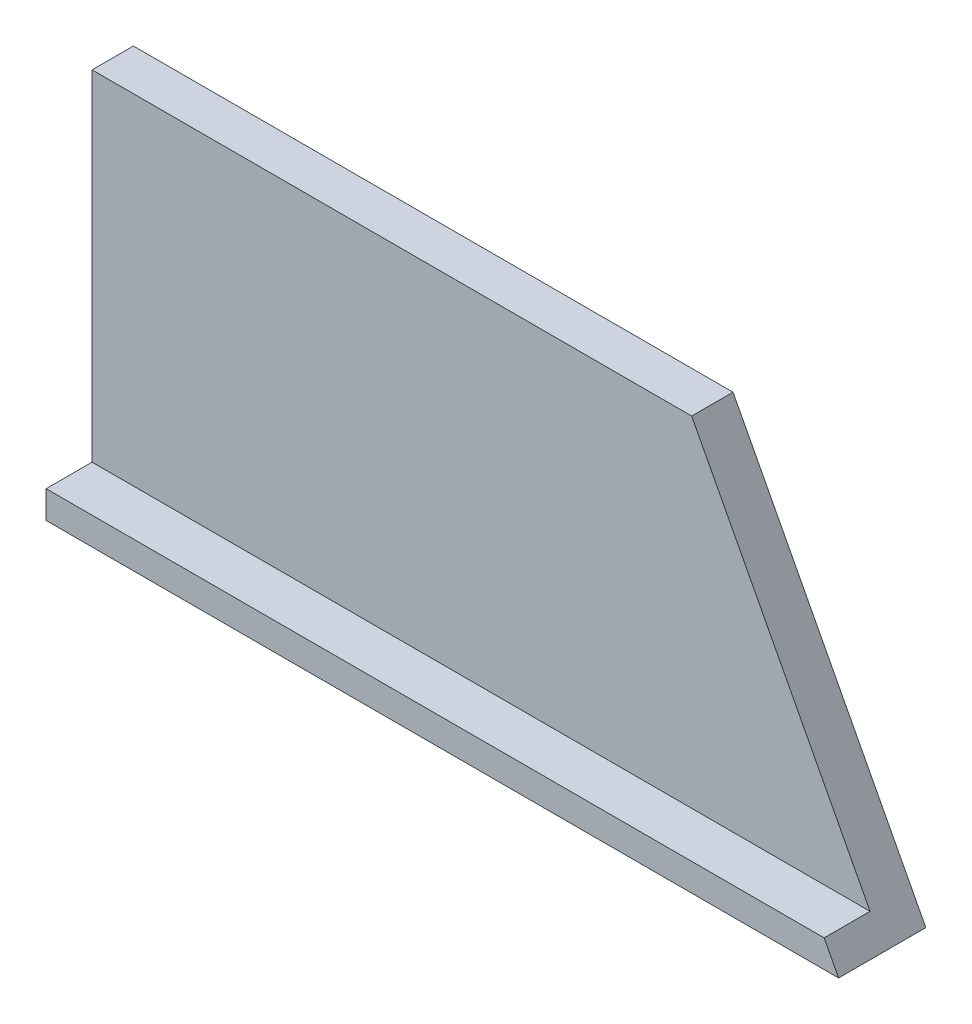
ISO-10303-21;
HEADER;
FILE_DESCRIPTION(('STEP AP214'),'2;1');
FILE_NAME('part.step','',(''),(''),'','','');
FILE_SCHEMA(('AUTOMOTIVE_DESIGN { 1 0 10303 214 1 1 1 1 }'));
ENDSEC;
DATA;
#1=APPLICATION_CONTEXT('core data for automotive mechanical design processes');
#2=APPLICATION_PROTOCOL_DEFINITION('international standard','automotive_design',2000,#1);
#3=PRODUCT_CONTEXT('',#1,'mechanical');
#4=PRODUCT('Part','Part','',(#3));
#5=PRODUCT_RELATED_PRODUCT_CATEGORY('part','',(#4));
#6=PRODUCT_DEFINITION_FORMATION('','',#4);
#7=PRODUCT_DEFINITION_CONTEXT('part definition',#1,'design');
#8=PRODUCT_DEFINITION('design','',#6,#7);
#9=PRODUCT_DEFINITION_SHAPE('','',#8);
#10=(LENGTH_UNIT() NAMED_UNIT(*) SI_UNIT(.MILLI.,.METRE.));
#11=(NAMED_UNIT(*) PLANE_ANGLE_UNIT() SI_UNIT($,.RADIAN.));
#12=(NAMED_UNIT(*) SI_UNIT($,.STERADIAN.) SOLID_ANGLE_UNIT());
#13=UNCERTAINTY_MEASURE_WITH_UNIT(LENGTH_MEASURE(1.E-05),#10,'distance_accuracy_value','');
#14=(GEOMETRIC_REPRESENTATION_CONTEXT(3) GLOBAL_UNCERTAINTY_ASSIGNED_CONTEXT((#13)) GLOBAL_UNIT_ASSIGNED_CONTEXT((#10,
#11,#12)) REPRESENTATION_CONTEXT('',''));
#15=CARTESIAN_POINT('',(0.,0.,0.));
#16=DIRECTION('',(0.,0.,1.));
#17=DIRECTION('',(1.,0.,0.));
#18=AXIS2_PLACEMENT_3D('',#15,#16,#17);
#19=CARTESIAN_POINT('',(156.4,4.5,9.5));
#20=DIRECTION('',(-0.885397902837944,-0.464833898989919,0.));
#21=DIRECTION('',(0.464833898989919,-0.885397902837944,0.));
#22=AXIS2_PLACEMENT_3D('',#19,#20,#21);
#23=PLANE('',#22);
#24=DIRECTION('',(0.,0.,-1.));
#25=VECTOR('',#24,1.);
#26=CARTESIAN_POINT('',(156.4,4.5,9.5));
#27=LINE('',#26,#25);
#28=CARTESIAN_POINT('',(156.4,4.5,9.5));
#29=VERTEX_POINT('',#28);
#30=CARTESIAN_POINT('',(156.4,4.5,0.));
#31=VERTEX_POINT('',#30);
#32=EDGE_CURVE('E11',#29,#31,#27,.T.);
#33=ORIENTED_EDGE('',*,*,#32,.T.);
#34=DIRECTION('',(0.46483389898992,-0.885397902837944,0.));
#35=VECTOR('',#34,1.);
#36=CARTESIAN_POINT('',(156.4,4.5,0.));
#37=LINE('',#36,#35);
#38=CARTESIAN_POINT('',(135.4,44.5,0.));
#39=VERTEX_POINT('',#38);
#40=EDGE_CURVE('E135',#39,#31,#37,.T.);
#41=ORIENTED_EDGE('',*,*,#40,.F.);
#42=DIRECTION('',(0.,0.,1.));
#43=VECTOR('',#42,1.);
#44=CARTESIAN_POINT('',(135.4,44.5,0.));
#45=LINE('',#44,#43);
#46=CARTESIAN_POINT('',(135.4,44.5,4.5));
#47=VERTEX_POINT('',#46);
#48=EDGE_CURVE('E132',#39,#47,#45,.T.);
#49=ORIENTED_EDGE('',*,*,#48,.T.);
#50=DIRECTION('',(-0.46483389898992,0.885397902837944,0.));
#51=VECTOR('',#50,1.);
#52=CARTESIAN_POINT('',(106.144047035767,100.225624693778,4.5));
#53=LINE('',#52,#51);
#54=CARTESIAN_POINT('',(154.825,7.49999999999999,4.5));
#55=VERTEX_POINT('',#54);
#56=EDGE_CURVE('E128',#55,#47,#53,.T.);
#57=ORIENTED_EDGE('',*,*,#56,.F.);
#58=DIRECTION('',(0.,0.,-1.));
#59=VECTOR('',#58,1.);
#60=CARTESIAN_POINT('',(154.825,7.5,9.5));
#61=LINE('',#60,#59);
#62=CARTESIAN_POINT('',(154.825,7.5,9.5));
#63=VERTEX_POINT('',#62);
#64=EDGE_CURVE('E46',#63,#55,#61,.T.);
#65=ORIENTED_EDGE('',*,*,#64,.F.);
#66=DIRECTION('',(-0.464833898989919,0.885397902837944,0.));
#67=VECTOR('',#66,1.);
#68=CARTESIAN_POINT('',(156.4,4.5,9.5));
#69=LINE('',#68,#67);
#70=EDGE_CURVE('E53',#29,#63,#69,.T.);
#71=ORIENTED_EDGE('',*,*,#70,.F.);
#72=EDGE_LOOP('',(#33,#41,#49,#57,#65,#71));
#73=FACE_BOUND('',#72,.T.);
#74=ADVANCED_FACE('F38',(#73),#23,.F.);
#75=CARTESIAN_POINT('',(0.,4.5,0.));
#76=DIRECTION('',(0.,0.,1.));
#77=DIRECTION('',(1.,0.,0.));
#78=AXIS2_PLACEMENT_3D('',#75,#76,#77);
#79=PLANE('',#78);
#80=ORIENTED_EDGE('',*,*,#40,.T.);
#81=DIRECTION('',(-1.,0.,0.));
#82=VECTOR('',#81,1.);
#83=CARTESIAN_POINT('',(0.,4.5,0.));
#84=LINE('',#83,#82);
#85=CARTESIAN_POINT('',(70.1,4.5,0.));
#86=VERTEX_POINT('',#85);
#87=EDGE_CURVE('E104',#31,#86,#84,.T.);
#88=ORIENTED_EDGE('',*,*,#87,.T.);
#89=DIRECTION('',(0.,1.,0.));
#90=VECTOR('',#89,1.);
#91=CARTESIAN_POINT('',(70.1,4.5,0.));
#92=LINE('',#91,#90);
#93=CARTESIAN_POINT('',(70.1,44.5,0.));
#94=VERTEX_POINT('',#93);
#95=EDGE_CURVE('E124',#86,#94,#92,.T.);
#96=ORIENTED_EDGE('',*,*,#95,.T.);
#97=DIRECTION('',(-1.,0.,0.));
#98=VECTOR('',#97,1.);
#99=CARTESIAN_POINT('',(0.,44.5,0.));
#100=LINE('',#99,#98);
#101=EDGE_CURVE('E111',#39,#94,#100,.T.);
#102=ORIENTED_EDGE('',*,*,#101,.F.);
#103=EDGE_LOOP('',(#80,#88,#96,#102));
#104=FACE_BOUND('',#103,.T.);
#105=ADVANCED_FACE('F141',(#104),#79,.F.);
#106=CARTESIAN_POINT('',(0.,44.5,0.));
#107=DIRECTION('',(0.,1.,0.));
#108=DIRECTION('',(0.,0.,1.));
#109=AXIS2_PLACEMENT_3D('',#106,#107,#108);
#110=PLANE('',#109);
#111=ORIENTED_EDGE('',*,*,#48,.F.);
#112=ORIENTED_EDGE('',*,*,#101,.T.);
#113=DIRECTION('',(0.,0.,1.));
#114=VECTOR('',#113,1.);
#115=CARTESIAN_POINT('',(70.1,44.5,0.));
#116=LINE('',#115,#114);
#117=CARTESIAN_POINT('',(70.1,44.5,4.5));
#118=VERTEX_POINT('',#117);
#119=EDGE_CURVE('E122',#94,#118,#116,.T.);
#120=ORIENTED_EDGE('',*,*,#119,.T.);
#121=DIRECTION('',(1.,0.,0.));
#122=VECTOR('',#121,1.);
#123=CARTESIAN_POINT('',(0.,44.5,4.5));
#124=LINE('',#123,#122);
#125=EDGE_CURVE('E112',#118,#47,#124,.T.);
#126=ORIENTED_EDGE('',*,*,#125,.T.);
#127=EDGE_LOOP('',(#111,#112,#120,#126));
#128=FACE_BOUND('',#127,.T.);
#129=ADVANCED_FACE('F144',(#128),#110,.T.);
#130=CARTESIAN_POINT('',(0.,44.5,4.5));
#131=DIRECTION('',(0.,0.,-1.));
#132=DIRECTION('',(-1.,0.,0.));
#133=AXIS2_PLACEMENT_3D('',#130,#131,#132);
#134=PLANE('',#133);
#135=DIRECTION('',(0.,1.,0.));
#136=VECTOR('',#135,1.);
#137=CARTESIAN_POINT('',(70.1,4.5,4.5));
#138=LINE('',#137,#136);
#139=CARTESIAN_POINT('',(70.1,7.49999999999999,4.5));
#140=VERTEX_POINT('',#139);
#141=EDGE_CURVE('E126',#140,#118,#138,.T.);
#142=ORIENTED_EDGE('',*,*,#141,.F.);
#143=DIRECTION('',(-1.,0.,0.));
#144=VECTOR('',#143,1.);
#145=CARTESIAN_POINT('',(154.825,7.5,4.5));
#146=LINE('',#145,#144);
#147=EDGE_CURVE('E103',#55,#140,#146,.T.);
#148=ORIENTED_EDGE('',*,*,#147,.F.);
#149=ORIENTED_EDGE('',*,*,#56,.T.);
#150=ORIENTED_EDGE('',*,*,#125,.F.);
#151=EDGE_LOOP('',(#142,#148,#149,#150));
#152=FACE_BOUND('',#151,.T.);
#153=ADVANCED_FACE('F146',(#152),#134,.F.);
#154=CARTESIAN_POINT('',(70.1,4.5,0.));
#155=DIRECTION('',(1.,0.,0.));
#156=DIRECTION('',(0.,0.,-1.));
#157=AXIS2_PLACEMENT_3D('',#154,#155,#156);
#158=PLANE('',#157);
#159=DIRECTION('',(0.,0.,1.));
#160=VECTOR('',#159,1.);
#161=CARTESIAN_POINT('',(70.1,4.5,0.));
#162=LINE('',#161,#160);
#163=CARTESIAN_POINT('',(70.1,4.5,9.5));
#164=VERTEX_POINT('',#163);
#165=EDGE_CURVE('E95',#86,#164,#162,.T.);
#166=ORIENTED_EDGE('',*,*,#165,.T.);
#167=DIRECTION('',(0.,-1.,0.));
#168=VECTOR('',#167,1.);
#169=CARTESIAN_POINT('',(70.1,7.49999999999999,9.5));
#170=LINE('',#169,#168);
#171=CARTESIAN_POINT('',(70.1,7.49999999999999,9.5));
#172=VERTEX_POINT('',#171);
#173=EDGE_CURVE('E89',#172,#164,#170,.T.);
#174=ORIENTED_EDGE('',*,*,#173,.F.);
#175=DIRECTION('',(0.,0.,-1.));
#176=VECTOR('',#175,1.);
#177=CARTESIAN_POINT('',(70.1,7.49999999999999,9.5));
#178=LINE('',#177,#176);
#179=EDGE_CURVE('E92',#172,#140,#178,.T.);
#180=ORIENTED_EDGE('',*,*,#179,.T.);
#181=ORIENTED_EDGE('',*,*,#141,.T.);
#182=ORIENTED_EDGE('',*,*,#119,.F.);
#183=ORIENTED_EDGE('',*,*,#95,.F.);
#184=EDGE_LOOP('',(#166,#174,#180,#181,#182,#183));
#185=FACE_BOUND('',#184,.T.);
#186=ADVANCED_FACE('F91',(#185),#158,.F.);
#187=CARTESIAN_POINT('',(0.,0.,9.5));
#188=DIRECTION('',(0.,0.,1.));
#189=DIRECTION('',(1.,0.,0.));
#190=AXIS2_PLACEMENT_3D('',#187,#188,#189);
#191=PLANE('',#190);
#192=ORIENTED_EDGE('',*,*,#173,.T.);
#193=DIRECTION('',(1.,0.,0.));
#194=VECTOR('',#193,1.);
#195=CARTESIAN_POINT('',(-21.,4.5,9.5));
#196=LINE('',#195,#194);
#197=EDGE_CURVE('E58',#164,#29,#196,.T.);
#198=ORIENTED_EDGE('',*,*,#197,.T.);
#199=ORIENTED_EDGE('',*,*,#70,.T.);
#200=DIRECTION('',(-1.,0.,0.));
#201=VECTOR('',#200,1.);
#202=CARTESIAN_POINT('',(154.825,7.5,9.5));
#203=LINE('',#202,#201);
#204=EDGE_CURVE('E102',#63,#172,#203,.T.);
#205=ORIENTED_EDGE('',*,*,#204,.T.);
#206=EDGE_LOOP('',(#192,#198,#199,#205));
#207=FACE_BOUND('',#206,.T.);
#208=ADVANCED_FACE('F106',(#207),#191,.T.);
#209=CARTESIAN_POINT('',(154.825,7.5,9.5));
#210=DIRECTION('',(0.,-1.,0.));
#211=DIRECTION('',(1.,0.,0.));
#212=AXIS2_PLACEMENT_3D('',#209,#210,#211);
#213=PLANE('',#212);
#214=ORIENTED_EDGE('',*,*,#147,.T.);
#215=ORIENTED_EDGE('',*,*,#179,.F.);
#216=ORIENTED_EDGE('',*,*,#204,.F.);
#217=ORIENTED_EDGE('',*,*,#64,.T.);
#218=EDGE_LOOP('',(#214,#215,#216,#217));
#219=FACE_BOUND('',#218,.T.);
#220=ADVANCED_FACE('F100',(#219),#213,.F.);
#221=CARTESIAN_POINT('',(-21.,4.5,-3.20000000000006));
#222=DIRECTION('',(0.,1.,0.));
#223=DIRECTION('',(0.,0.,1.));
#224=AXIS2_PLACEMENT_3D('',#221,#222,#223);
#225=PLANE('',#224);
#226=ORIENTED_EDGE('',*,*,#197,.F.);
#227=ORIENTED_EDGE('',*,*,#165,.F.);
#228=ORIENTED_EDGE('',*,*,#87,.F.);
#229=ORIENTED_EDGE('',*,*,#32,.F.);
#230=EDGE_LOOP('',(#226,#227,#228,#229));
#231=FACE_BOUND('',#230,.T.);
#232=ADVANCED_FACE('F40',(#231),#225,.F.);
#233=CLOSED_SHELL('',(#74,#105,#129,#153,#186,#208,#220,#232));
#234=MANIFOLD_SOLID_BREP('B2',#233);
#235=ADVANCED_BREP_SHAPE_REPRESENTATION('',(#18,#234),#14);
#236=SHAPE_DEFINITION_REPRESENTATION(#9,#235);
ENDSEC;
END-ISO-10303-21;
